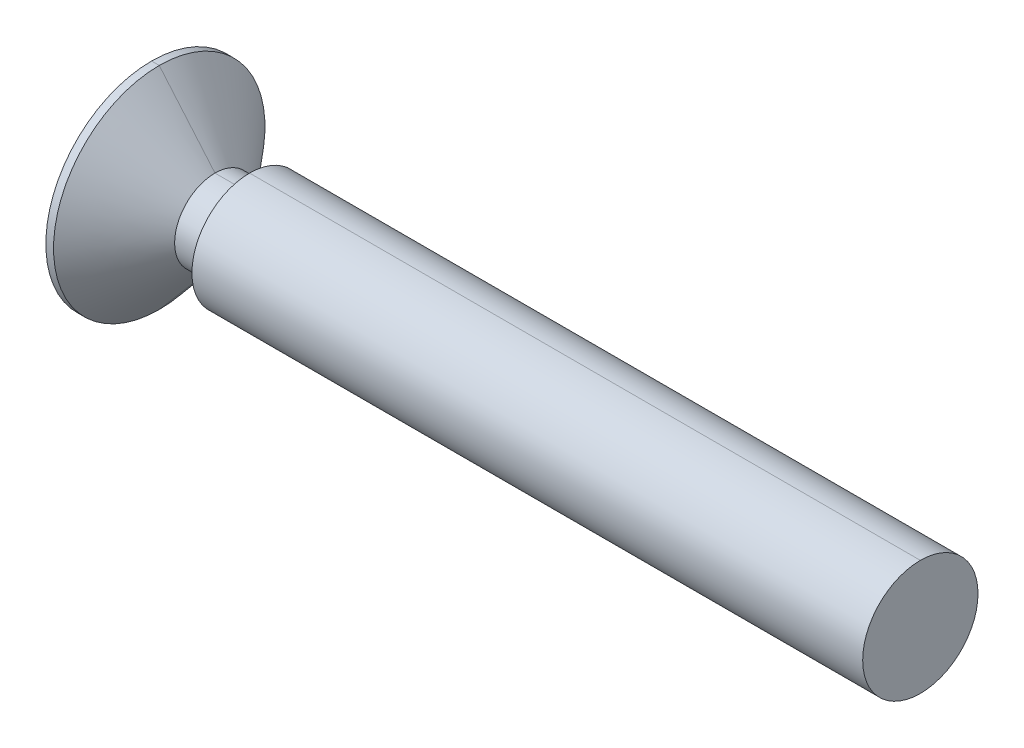
ISO-10303-21;
HEADER;
FILE_DESCRIPTION(('STEP AP214'),'2;1');
FILE_NAME('part.step','',(''),(''),'','','');
FILE_SCHEMA(('AUTOMOTIVE_DESIGN { 1 0 10303 214 1 1 1 1 }'));
ENDSEC;
DATA;
#1=APPLICATION_CONTEXT('core data for automotive mechanical design processes');
#2=APPLICATION_PROTOCOL_DEFINITION('international standard','automotive_design',2000,#1);
#3=PRODUCT_CONTEXT('',#1,'mechanical');
#4=PRODUCT('Part','Part','',(#3));
#5=PRODUCT_RELATED_PRODUCT_CATEGORY('part','',(#4));
#6=PRODUCT_DEFINITION_FORMATION('','',#4);
#7=PRODUCT_DEFINITION_CONTEXT('part definition',#1,'design');
#8=PRODUCT_DEFINITION('design','',#6,#7);
#9=PRODUCT_DEFINITION_SHAPE('','',#8);
#10=(LENGTH_UNIT() NAMED_UNIT(*) SI_UNIT(.MILLI.,.METRE.));
#11=(NAMED_UNIT(*) PLANE_ANGLE_UNIT() SI_UNIT($,.RADIAN.));
#12=(NAMED_UNIT(*) SI_UNIT($,.STERADIAN.) SOLID_ANGLE_UNIT());
#13=UNCERTAINTY_MEASURE_WITH_UNIT(LENGTH_MEASURE(1.E-05),#10,'distance_accuracy_value','');
#14=(GEOMETRIC_REPRESENTATION_CONTEXT(3) GLOBAL_UNCERTAINTY_ASSIGNED_CONTEXT((#13)) GLOBAL_UNIT_ASSIGNED_CONTEXT((#10,
#11,#12)) REPRESENTATION_CONTEXT('',''));
#15=CARTESIAN_POINT('',(0.,0.,0.));
#16=DIRECTION('',(0.,0.,1.));
#17=DIRECTION('',(1.,0.,0.));
#18=AXIS2_PLACEMENT_3D('',#15,#16,#17);
#19=CARTESIAN_POINT('',(-19.175,0.675,-0.675));
#20=DIRECTION('',(1.,0.,0.));
#21=DIRECTION('',(0.,1.,0.));
#22=AXIS2_PLACEMENT_3D('',#19,#20,#21);
#23=PLANE('',#22);
#24=DIRECTION('',(0.,-1.,0.));
#25=VECTOR('',#24,1.);
#26=CARTESIAN_POINT('',(-19.175,1.8,-0.375));
#27=LINE('',#26,#25);
#28=CARTESIAN_POINT('',(-19.175,1.8,-0.375));
#29=VERTEX_POINT('',#28);
#30=CARTESIAN_POINT('',(-19.175,0.675,-0.375));
#31=VERTEX_POINT('',#30);
#32=EDGE_CURVE('E369',#29,#31,#27,.T.);
#33=ORIENTED_EDGE('',*,*,#32,.T.);
#34=CARTESIAN_POINT('',(-19.175,0.675,-0.675));
#35=DIRECTION('',(1.,0.,0.));
#36=DIRECTION('',(0.,1.,0.));
#37=AXIS2_PLACEMENT_3D('',#34,#35,#36);
#38=CIRCLE('',#37,0.3);
#39=CARTESIAN_POINT('',(-19.175,0.375,-0.675));
#40=VERTEX_POINT('',#39);
#41=EDGE_CURVE('E10',#31,#40,#38,.T.);
#42=ORIENTED_EDGE('',*,*,#41,.T.);
#43=DIRECTION('',(0.,0.,-1.));
#44=VECTOR('',#43,1.);
#45=CARTESIAN_POINT('',(-19.175,0.375,-1.8));
#46=LINE('',#45,#44);
#47=CARTESIAN_POINT('',(-19.175,0.375,-1.8));
#48=VERTEX_POINT('',#47);
#49=EDGE_CURVE('E365',#40,#48,#46,.T.);
#50=ORIENTED_EDGE('',*,*,#49,.T.);
#51=DIRECTION('',(0.,-1.,0.));
#52=VECTOR('',#51,1.);
#53=CARTESIAN_POINT('',(-19.175,0.375,-1.8));
#54=LINE('',#53,#52);
#55=CARTESIAN_POINT('',(-19.175,-0.375,-1.8));
#56=VERTEX_POINT('',#55);
#57=EDGE_CURVE('E425',#48,#56,#54,.T.);
#58=ORIENTED_EDGE('',*,*,#57,.T.);
#59=DIRECTION('',(0.,0.,1.));
#60=VECTOR('',#59,1.);
#61=CARTESIAN_POINT('',(-19.175,-0.375,-1.8));
#62=LINE('',#61,#60);
#63=CARTESIAN_POINT('',(-19.175,-0.375,-0.675));
#64=VERTEX_POINT('',#63);
#65=EDGE_CURVE('E335',#56,#64,#62,.T.);
#66=ORIENTED_EDGE('',*,*,#65,.T.);
#67=CARTESIAN_POINT('',(-19.175,-0.675,-0.675));
#68=DIRECTION('',(1.,0.,0.));
#69=DIRECTION('',(0.,-1.,0.));
#70=AXIS2_PLACEMENT_3D('',#67,#68,#69);
#71=CIRCLE('',#70,0.3);
#72=CARTESIAN_POINT('',(-19.175,-0.675,-0.375));
#73=VERTEX_POINT('',#72);
#74=EDGE_CURVE('E336',#64,#73,#71,.T.);
#75=ORIENTED_EDGE('',*,*,#74,.T.);
#76=DIRECTION('',(0.,-1.,0.));
#77=VECTOR('',#76,1.);
#78=CARTESIAN_POINT('',(-19.175,-0.675,-0.375));
#79=LINE('',#78,#77);
#80=CARTESIAN_POINT('',(-19.175,-1.8,-0.375));
#81=VERTEX_POINT('',#80);
#82=EDGE_CURVE('E286',#73,#81,#79,.T.);
#83=ORIENTED_EDGE('',*,*,#82,.T.);
#84=DIRECTION('',(0.,0.,1.));
#85=VECTOR('',#84,1.);
#86=CARTESIAN_POINT('',(-19.175,-1.8,-0.375));
#87=LINE('',#86,#85);
#88=CARTESIAN_POINT('',(-19.175,-1.8,0.375));
#89=VERTEX_POINT('',#88);
#90=EDGE_CURVE('E299',#81,#89,#87,.T.);
#91=ORIENTED_EDGE('',*,*,#90,.T.);
#92=DIRECTION('',(0.,1.,0.));
#93=VECTOR('',#92,1.);
#94=CARTESIAN_POINT('',(-19.175,-0.675,0.375));
#95=LINE('',#94,#93);
#96=CARTESIAN_POINT('',(-19.175,-0.675,0.375));
#97=VERTEX_POINT('',#96);
#98=EDGE_CURVE('E156',#89,#97,#95,.T.);
#99=ORIENTED_EDGE('',*,*,#98,.T.);
#100=CARTESIAN_POINT('',(-19.175,-0.675,0.675));
#101=DIRECTION('',(1.,0.,0.));
#102=DIRECTION('',(0.,1.,0.));
#103=AXIS2_PLACEMENT_3D('',#100,#101,#102);
#104=CIRCLE('',#103,0.3);
#105=CARTESIAN_POINT('',(-19.175,-0.375,0.675));
#106=VERTEX_POINT('',#105);
#107=EDGE_CURVE('E166',#97,#106,#104,.T.);
#108=ORIENTED_EDGE('',*,*,#107,.T.);
#109=DIRECTION('',(0.,0.,1.));
#110=VECTOR('',#109,1.);
#111=CARTESIAN_POINT('',(-19.175,-0.375,0.675));
#112=LINE('',#111,#110);
#113=CARTESIAN_POINT('',(-19.175,-0.375,1.8));
#114=VERTEX_POINT('',#113);
#115=EDGE_CURVE('E293',#106,#114,#112,.T.);
#116=ORIENTED_EDGE('',*,*,#115,.T.);
#117=DIRECTION('',(0.,1.,0.));
#118=VECTOR('',#117,1.);
#119=CARTESIAN_POINT('',(-19.175,0.375,1.8));
#120=LINE('',#119,#118);
#121=CARTESIAN_POINT('',(-19.175,0.375,1.8));
#122=VERTEX_POINT('',#121);
#123=EDGE_CURVE('E338',#114,#122,#120,.T.);
#124=ORIENTED_EDGE('',*,*,#123,.T.);
#125=DIRECTION('',(0.,0.,-1.));
#126=VECTOR('',#125,1.);
#127=CARTESIAN_POINT('',(-19.175,0.375,0.675));
#128=LINE('',#127,#126);
#129=CARTESIAN_POINT('',(-19.175,0.375,0.675));
#130=VERTEX_POINT('',#129);
#131=EDGE_CURVE('E349',#122,#130,#128,.T.);
#132=ORIENTED_EDGE('',*,*,#131,.T.);
#133=CARTESIAN_POINT('',(-19.175,0.675,0.675));
#134=DIRECTION('',(1.,0.,0.));
#135=DIRECTION('',(0.,1.,0.));
#136=AXIS2_PLACEMENT_3D('',#133,#134,#135);
#137=CIRCLE('',#136,0.3);
#138=CARTESIAN_POINT('',(-19.175,0.675,0.375));
#139=VERTEX_POINT('',#138);
#140=EDGE_CURVE('E383',#130,#139,#137,.T.);
#141=ORIENTED_EDGE('',*,*,#140,.T.);
#142=DIRECTION('',(0.,1.,0.));
#143=VECTOR('',#142,1.);
#144=CARTESIAN_POINT('',(-19.175,1.8,0.375));
#145=LINE('',#144,#143);
#146=CARTESIAN_POINT('',(-19.175,1.8,0.375));
#147=VERTEX_POINT('',#146);
#148=EDGE_CURVE('E271',#139,#147,#145,.T.);
#149=ORIENTED_EDGE('',*,*,#148,.T.);
#150=DIRECTION('',(0.,0.,-1.));
#151=VECTOR('',#150,1.);
#152=CARTESIAN_POINT('',(-19.175,1.8,-0.375));
#153=LINE('',#152,#151);
#154=EDGE_CURVE('E278',#147,#29,#153,.T.);
#155=ORIENTED_EDGE('',*,*,#154,.T.);
#156=EDGE_LOOP('',(#33,#42,#50,#58,#66,#75,#83,#91,#99,#108,#116,#124,#132,#141,#149,#155));
#157=FACE_BOUND('',#156,.T.);
#158=ADVANCED_FACE('F16',(#157),#23,.F.);
#159=CARTESIAN_POINT('',(-19.175,0.675,-0.675));
#160=DIRECTION('',(-1.,0.,0.));
#161=DIRECTION('',(0.,-1.,0.));
#162=AXIS2_PLACEMENT_3D('',#159,#160,#161);
#163=CYLINDRICAL_SURFACE('',#162,0.3);
#164=CARTESIAN_POINT('',(-20.,0.675,-0.675));
#165=DIRECTION('',(1.,0.,0.));
#166=DIRECTION('',(0.,1.,0.));
#167=AXIS2_PLACEMENT_3D('',#164,#165,#166);
#168=CIRCLE('',#167,0.3);
#169=CARTESIAN_POINT('',(-20.,0.675,-0.375));
#170=VERTEX_POINT('',#169);
#171=CARTESIAN_POINT('',(-20.,0.375,-0.675));
#172=VERTEX_POINT('',#171);
#173=EDGE_CURVE('E322',#170,#172,#168,.T.);
#174=ORIENTED_EDGE('',*,*,#173,.T.);
#175=DIRECTION('',(-1.,0.,0.));
#176=VECTOR('',#175,1.);
#177=CARTESIAN_POINT('',(-19.175,0.375,-0.675));
#178=LINE('',#177,#176);
#179=EDGE_CURVE('E27',#40,#172,#178,.T.);
#180=ORIENTED_EDGE('',*,*,#179,.F.);
#181=ORIENTED_EDGE('',*,*,#41,.F.);
#182=DIRECTION('',(-1.,0.,0.));
#183=VECTOR('',#182,1.);
#184=CARTESIAN_POINT('',(-19.175,0.675,-0.375));
#185=LINE('',#184,#183);
#186=EDGE_CURVE('E267',#31,#170,#185,.T.);
#187=ORIENTED_EDGE('',*,*,#186,.T.);
#188=EDGE_LOOP('',(#174,#180,#181,#187));
#189=FACE_BOUND('',#188,.T.);
#190=ADVANCED_FACE('F727',(#189),#163,.T.);
#191=CARTESIAN_POINT('',(-19.175,0.375,-1.8));
#192=DIRECTION('',(0.,1.,0.));
#193=DIRECTION('',(1.,0.,0.));
#194=AXIS2_PLACEMENT_3D('',#191,#192,#193);
#195=PLANE('',#194);
#196=DIRECTION('',(0.,0.,-1.));
#197=VECTOR('',#196,1.);
#198=CARTESIAN_POINT('',(-20.,0.375,-1.8));
#199=LINE('',#198,#197);
#200=CARTESIAN_POINT('',(-20.,0.375,-1.8));
#201=VERTEX_POINT('',#200);
#202=EDGE_CURVE('E318',#172,#201,#199,.T.);
#203=ORIENTED_EDGE('',*,*,#202,.T.);
#204=DIRECTION('',(-1.,0.,0.));
#205=VECTOR('',#204,1.);
#206=CARTESIAN_POINT('',(-19.175,0.375,-1.8));
#207=LINE('',#206,#205);
#208=EDGE_CURVE('E368',#48,#201,#207,.T.);
#209=ORIENTED_EDGE('',*,*,#208,.F.);
#210=ORIENTED_EDGE('',*,*,#49,.F.);
#211=ORIENTED_EDGE('',*,*,#179,.T.);
#212=EDGE_LOOP('',(#203,#209,#210,#211));
#213=FACE_BOUND('',#212,.T.);
#214=ADVANCED_FACE('F723',(#213),#195,.F.);
#215=CARTESIAN_POINT('',(-19.175,0.375,-1.8));
#216=DIRECTION('',(0.,0.,-1.));
#217=DIRECTION('',(0.,-1.,0.));
#218=AXIS2_PLACEMENT_3D('',#215,#216,#217);
#219=PLANE('',#218);
#220=DIRECTION('',(0.,-1.,0.));
#221=VECTOR('',#220,1.);
#222=CARTESIAN_POINT('',(-20.,0.375,-1.8));
#223=LINE('',#222,#221);
#224=CARTESIAN_POINT('',(-20.,-0.375,-1.8));
#225=VERTEX_POINT('',#224);
#226=EDGE_CURVE('E323',#201,#225,#223,.T.);
#227=ORIENTED_EDGE('',*,*,#226,.T.);
#228=DIRECTION('',(-1.,0.,0.));
#229=VECTOR('',#228,1.);
#230=CARTESIAN_POINT('',(-19.175,-0.375,-1.8));
#231=LINE('',#230,#229);
#232=EDGE_CURVE('E422',#56,#225,#231,.T.);
#233=ORIENTED_EDGE('',*,*,#232,.F.);
#234=ORIENTED_EDGE('',*,*,#57,.F.);
#235=ORIENTED_EDGE('',*,*,#208,.T.);
#236=EDGE_LOOP('',(#227,#233,#234,#235));
#237=FACE_BOUND('',#236,.T.);
#238=ADVANCED_FACE('F485',(#237),#219,.F.);
#239=CARTESIAN_POINT('',(-19.175,-0.375,-1.8));
#240=DIRECTION('',(0.,-1.,0.));
#241=DIRECTION('',(0.,0.,-1.));
#242=AXIS2_PLACEMENT_3D('',#239,#240,#241);
#243=PLANE('',#242);
#244=DIRECTION('',(0.,0.,1.));
#245=VECTOR('',#244,1.);
#246=CARTESIAN_POINT('',(-20.,-0.375,-1.8));
#247=LINE('',#246,#245);
#248=CARTESIAN_POINT('',(-20.,-0.375,-0.675));
#249=VERTEX_POINT('',#248);
#250=EDGE_CURVE('E308',#225,#249,#247,.T.);
#251=ORIENTED_EDGE('',*,*,#250,.T.);
#252=DIRECTION('',(-1.,0.,0.));
#253=VECTOR('',#252,1.);
#254=CARTESIAN_POINT('',(-19.175,-0.375,-0.675));
#255=LINE('',#254,#253);
#256=EDGE_CURVE('E333',#64,#249,#255,.T.);
#257=ORIENTED_EDGE('',*,*,#256,.F.);
#258=ORIENTED_EDGE('',*,*,#65,.F.);
#259=ORIENTED_EDGE('',*,*,#232,.T.);
#260=EDGE_LOOP('',(#251,#257,#258,#259));
#261=FACE_BOUND('',#260,.T.);
#262=ADVANCED_FACE('F489',(#261),#243,.F.);
#263=CARTESIAN_POINT('',(-19.175,-0.675,-0.675));
#264=DIRECTION('',(-1.,0.,0.));
#265=DIRECTION('',(0.,-1.,0.));
#266=AXIS2_PLACEMENT_3D('',#263,#264,#265);
#267=CYLINDRICAL_SURFACE('',#266,0.3);
#268=CARTESIAN_POINT('',(-20.,-0.675,-0.675));
#269=DIRECTION('',(1.,0.,0.));
#270=DIRECTION('',(0.,-1.,0.));
#271=AXIS2_PLACEMENT_3D('',#268,#269,#270);
#272=CIRCLE('',#271,0.3);
#273=CARTESIAN_POINT('',(-20.,-0.675,-0.375));
#274=VERTEX_POINT('',#273);
#275=EDGE_CURVE('E304',#249,#274,#272,.T.);
#276=ORIENTED_EDGE('',*,*,#275,.T.);
#277=DIRECTION('',(-1.,0.,0.));
#278=VECTOR('',#277,1.);
#279=CARTESIAN_POINT('',(-19.175,-0.675,-0.375));
#280=LINE('',#279,#278);
#281=EDGE_CURVE('E289',#73,#274,#280,.T.);
#282=ORIENTED_EDGE('',*,*,#281,.F.);
#283=ORIENTED_EDGE('',*,*,#74,.F.);
#284=ORIENTED_EDGE('',*,*,#256,.T.);
#285=EDGE_LOOP('',(#276,#282,#283,#284));
#286=FACE_BOUND('',#285,.T.);
#287=ADVANCED_FACE('F494',(#286),#267,.T.);
#288=CARTESIAN_POINT('',(-19.175,-0.675,-0.375));
#289=DIRECTION('',(0.,0.,-1.));
#290=DIRECTION('',(0.,-1.,0.));
#291=AXIS2_PLACEMENT_3D('',#288,#289,#290);
#292=PLANE('',#291);
#293=DIRECTION('',(0.,-1.,0.));
#294=VECTOR('',#293,1.);
#295=CARTESIAN_POINT('',(-20.,-0.675,-0.375));
#296=LINE('',#295,#294);
#297=CARTESIAN_POINT('',(-20.,-1.8,-0.375));
#298=VERTEX_POINT('',#297);
#299=EDGE_CURVE('E309',#274,#298,#296,.T.);
#300=ORIENTED_EDGE('',*,*,#299,.T.);
#301=DIRECTION('',(-1.,0.,0.));
#302=VECTOR('',#301,1.);
#303=CARTESIAN_POINT('',(-19.175,-1.8,-0.375));
#304=LINE('',#303,#302);
#305=EDGE_CURVE('E290',#81,#298,#304,.T.);
#306=ORIENTED_EDGE('',*,*,#305,.F.);
#307=ORIENTED_EDGE('',*,*,#82,.F.);
#308=ORIENTED_EDGE('',*,*,#281,.T.);
#309=EDGE_LOOP('',(#300,#306,#307,#308));
#310=FACE_BOUND('',#309,.T.);
#311=ADVANCED_FACE('F500',(#310),#292,.F.);
#312=CARTESIAN_POINT('',(-19.175,-1.8,-0.375));
#313=DIRECTION('',(0.,-1.,0.));
#314=DIRECTION('',(0.,0.,-1.));
#315=AXIS2_PLACEMENT_3D('',#312,#313,#314);
#316=PLANE('',#315);
#317=DIRECTION('',(0.,0.,1.));
#318=VECTOR('',#317,1.);
#319=CARTESIAN_POINT('',(-20.,-1.8,-0.375));
#320=LINE('',#319,#318);
#321=CARTESIAN_POINT('',(-20.,-1.8,0.375));
#322=VERTEX_POINT('',#321);
#323=EDGE_CURVE('E402',#298,#322,#320,.T.);
#324=ORIENTED_EDGE('',*,*,#323,.T.);
#325=DIRECTION('',(-1.,0.,0.));
#326=VECTOR('',#325,1.);
#327=CARTESIAN_POINT('',(-19.175,-1.8,0.375));
#328=LINE('',#327,#326);
#329=EDGE_CURVE('E317',#89,#322,#328,.T.);
#330=ORIENTED_EDGE('',*,*,#329,.F.);
#331=ORIENTED_EDGE('',*,*,#90,.F.);
#332=ORIENTED_EDGE('',*,*,#305,.T.);
#333=EDGE_LOOP('',(#324,#330,#331,#332));
#334=FACE_BOUND('',#333,.T.);
#335=ADVANCED_FACE('F504',(#334),#316,.F.);
#336=CARTESIAN_POINT('',(-19.175,-0.675,0.375));
#337=DIRECTION('',(0.,0.,1.));
#338=DIRECTION('',(0.,-1.,0.));
#339=AXIS2_PLACEMENT_3D('',#336,#337,#338);
#340=PLANE('',#339);
#341=DIRECTION('',(0.,1.,0.));
#342=VECTOR('',#341,1.);
#343=CARTESIAN_POINT('',(-20.,-0.675,0.375));
#344=LINE('',#343,#342);
#345=CARTESIAN_POINT('',(-20.,-0.675,0.375));
#346=VERTEX_POINT('',#345);
#347=EDGE_CURVE('E332',#322,#346,#344,.T.);
#348=ORIENTED_EDGE('',*,*,#347,.T.);
#349=DIRECTION('',(-1.,0.,0.));
#350=VECTOR('',#349,1.);
#351=CARTESIAN_POINT('',(-19.175,-0.675,0.375));
#352=LINE('',#351,#350);
#353=EDGE_CURVE('E192',#97,#346,#352,.T.);
#354=ORIENTED_EDGE('',*,*,#353,.F.);
#355=ORIENTED_EDGE('',*,*,#98,.F.);
#356=ORIENTED_EDGE('',*,*,#329,.T.);
#357=EDGE_LOOP('',(#348,#354,#355,#356));
#358=FACE_BOUND('',#357,.T.);
#359=ADVANCED_FACE('F507',(#358),#340,.F.);
#360=CARTESIAN_POINT('',(-19.175,-0.675,0.675));
#361=DIRECTION('',(-1.,0.,0.));
#362=DIRECTION('',(0.,-1.,0.));
#363=AXIS2_PLACEMENT_3D('',#360,#361,#362);
#364=CYLINDRICAL_SURFACE('',#363,0.3);
#365=CARTESIAN_POINT('',(-20.,-0.675,0.675));
#366=DIRECTION('',(1.,0.,0.));
#367=DIRECTION('',(0.,1.,0.));
#368=AXIS2_PLACEMENT_3D('',#365,#366,#367);
#369=CIRCLE('',#368,0.3);
#370=CARTESIAN_POINT('',(-20.,-0.375,0.675));
#371=VERTEX_POINT('',#370);
#372=EDGE_CURVE('E313',#346,#371,#369,.T.);
#373=ORIENTED_EDGE('',*,*,#372,.T.);
#374=DIRECTION('',(-1.,0.,0.));
#375=VECTOR('',#374,1.);
#376=CARTESIAN_POINT('',(-19.175,-0.375,0.675));
#377=LINE('',#376,#375);
#378=EDGE_CURVE('E184',#106,#371,#377,.T.);
#379=ORIENTED_EDGE('',*,*,#378,.F.);
#380=ORIENTED_EDGE('',*,*,#107,.F.);
#381=ORIENTED_EDGE('',*,*,#353,.T.);
#382=EDGE_LOOP('',(#373,#379,#380,#381));
#383=FACE_BOUND('',#382,.T.);
#384=ADVANCED_FACE('F509',(#383),#364,.T.);
#385=CARTESIAN_POINT('',(-19.175,-0.375,0.675));
#386=DIRECTION('',(0.,-1.,0.));
#387=DIRECTION('',(0.,0.,-1.));
#388=AXIS2_PLACEMENT_3D('',#385,#386,#387);
#389=PLANE('',#388);
#390=DIRECTION('',(0.,0.,1.));
#391=VECTOR('',#390,1.);
#392=CARTESIAN_POINT('',(-20.,-0.375,0.675));
#393=LINE('',#392,#391);
#394=CARTESIAN_POINT('',(-20.,-0.375,1.8));
#395=VERTEX_POINT('',#394);
#396=EDGE_CURVE('E310',#371,#395,#393,.T.);
#397=ORIENTED_EDGE('',*,*,#396,.T.);
#398=DIRECTION('',(-1.,0.,0.));
#399=VECTOR('',#398,1.);
#400=CARTESIAN_POINT('',(-19.175,-0.375,1.8));
#401=LINE('',#400,#399);
#402=EDGE_CURVE('E341',#114,#395,#401,.T.);
#403=ORIENTED_EDGE('',*,*,#402,.F.);
#404=ORIENTED_EDGE('',*,*,#115,.F.);
#405=ORIENTED_EDGE('',*,*,#378,.T.);
#406=EDGE_LOOP('',(#397,#403,#404,#405));
#407=FACE_BOUND('',#406,.T.);
#408=ADVANCED_FACE('F512',(#407),#389,.F.);
#409=CARTESIAN_POINT('',(-19.175,0.375,1.8));
#410=DIRECTION('',(0.,0.,1.));
#411=DIRECTION('',(1.,0.,0.));
#412=AXIS2_PLACEMENT_3D('',#409,#410,#411);
#413=PLANE('',#412);
#414=DIRECTION('',(0.,1.,0.));
#415=VECTOR('',#414,1.);
#416=CARTESIAN_POINT('',(-20.,0.375,1.8));
#417=LINE('',#416,#415);
#418=CARTESIAN_POINT('',(-20.,0.375,1.8));
#419=VERTEX_POINT('',#418);
#420=EDGE_CURVE('E314',#395,#419,#417,.T.);
#421=ORIENTED_EDGE('',*,*,#420,.T.);
#422=DIRECTION('',(-1.,0.,0.));
#423=VECTOR('',#422,1.);
#424=CARTESIAN_POINT('',(-19.175,0.375,1.8));
#425=LINE('',#424,#423);
#426=EDGE_CURVE('E342',#122,#419,#425,.T.);
#427=ORIENTED_EDGE('',*,*,#426,.F.);
#428=ORIENTED_EDGE('',*,*,#123,.F.);
#429=ORIENTED_EDGE('',*,*,#402,.T.);
#430=EDGE_LOOP('',(#421,#427,#428,#429));
#431=FACE_BOUND('',#430,.T.);
#432=ADVANCED_FACE('F518',(#431),#413,.F.);
#433=CARTESIAN_POINT('',(-19.175,0.375,0.675));
#434=DIRECTION('',(0.,1.,0.));
#435=DIRECTION('',(0.,0.,-1.));
#436=AXIS2_PLACEMENT_3D('',#433,#434,#435);
#437=PLANE('',#436);
#438=DIRECTION('',(0.,0.,-1.));
#439=VECTOR('',#438,1.);
#440=CARTESIAN_POINT('',(-20.,0.375,0.675));
#441=LINE('',#440,#439);
#442=CARTESIAN_POINT('',(-20.,0.375,0.675));
#443=VERTEX_POINT('',#442);
#444=EDGE_CURVE('E390',#419,#443,#441,.T.);
#445=ORIENTED_EDGE('',*,*,#444,.T.);
#446=DIRECTION('',(-1.,0.,0.));
#447=VECTOR('',#446,1.);
#448=CARTESIAN_POINT('',(-19.175,0.375,0.675));
#449=LINE('',#448,#447);
#450=EDGE_CURVE('E353',#130,#443,#449,.T.);
#451=ORIENTED_EDGE('',*,*,#450,.F.);
#452=ORIENTED_EDGE('',*,*,#131,.F.);
#453=ORIENTED_EDGE('',*,*,#426,.T.);
#454=EDGE_LOOP('',(#445,#451,#452,#453));
#455=FACE_BOUND('',#454,.T.);
#456=ADVANCED_FACE('F522',(#455),#437,.F.);
#457=CARTESIAN_POINT('',(-19.175,0.675,0.675));
#458=DIRECTION('',(-1.,0.,0.));
#459=DIRECTION('',(0.,-1.,0.));
#460=AXIS2_PLACEMENT_3D('',#457,#458,#459);
#461=CYLINDRICAL_SURFACE('',#460,0.3);
#462=CARTESIAN_POINT('',(-20.,0.675,0.675));
#463=DIRECTION('',(1.,0.,0.));
#464=DIRECTION('',(0.,1.,0.));
#465=AXIS2_PLACEMENT_3D('',#462,#463,#464);
#466=CIRCLE('',#465,0.3);
#467=CARTESIAN_POINT('',(-20.,0.675,0.375));
#468=VERTEX_POINT('',#467);
#469=EDGE_CURVE('E386',#443,#468,#466,.T.);
#470=ORIENTED_EDGE('',*,*,#469,.T.);
#471=DIRECTION('',(-1.,0.,0.));
#472=VECTOR('',#471,1.);
#473=CARTESIAN_POINT('',(-19.175,0.675,0.375));
#474=LINE('',#473,#472);
#475=EDGE_CURVE('E274',#139,#468,#474,.T.);
#476=ORIENTED_EDGE('',*,*,#475,.F.);
#477=ORIENTED_EDGE('',*,*,#140,.F.);
#478=ORIENTED_EDGE('',*,*,#450,.T.);
#479=EDGE_LOOP('',(#470,#476,#477,#478));
#480=FACE_BOUND('',#479,.T.);
#481=ADVANCED_FACE('F527',(#480),#461,.T.);
#482=CARTESIAN_POINT('',(-19.175,1.8,0.375));
#483=DIRECTION('',(0.,0.,1.));
#484=DIRECTION('',(0.,-1.,0.));
#485=AXIS2_PLACEMENT_3D('',#482,#483,#484);
#486=PLANE('',#485);
#487=DIRECTION('',(0.,1.,0.));
#488=VECTOR('',#487,1.);
#489=CARTESIAN_POINT('',(-20.,1.8,0.375));
#490=LINE('',#489,#488);
#491=CARTESIAN_POINT('',(-20.,1.8,0.375));
#492=VERTEX_POINT('',#491);
#493=EDGE_CURVE('E391',#468,#492,#490,.T.);
#494=ORIENTED_EDGE('',*,*,#493,.T.);
#495=DIRECTION('',(-1.,0.,0.));
#496=VECTOR('',#495,1.);
#497=CARTESIAN_POINT('',(-19.175,1.8,0.375));
#498=LINE('',#497,#496);
#499=EDGE_CURVE('E275',#147,#492,#498,.T.);
#500=ORIENTED_EDGE('',*,*,#499,.F.);
#501=ORIENTED_EDGE('',*,*,#148,.F.);
#502=ORIENTED_EDGE('',*,*,#475,.T.);
#503=EDGE_LOOP('',(#494,#500,#501,#502));
#504=FACE_BOUND('',#503,.T.);
#505=ADVANCED_FACE('F533',(#504),#486,.F.);
#506=CARTESIAN_POINT('',(-19.175,1.8,-0.375));
#507=DIRECTION('',(0.,1.,0.));
#508=DIRECTION('',(0.,0.,-1.));
#509=AXIS2_PLACEMENT_3D('',#506,#507,#508);
#510=PLANE('',#509);
#511=DIRECTION('',(0.,0.,-1.));
#512=VECTOR('',#511,1.);
#513=CARTESIAN_POINT('',(-20.,1.8,-0.375));
#514=LINE('',#513,#512);
#515=CARTESIAN_POINT('',(-20.,1.8,-0.375));
#516=VERTEX_POINT('',#515);
#517=EDGE_CURVE('E380',#492,#516,#514,.T.);
#518=ORIENTED_EDGE('',*,*,#517,.T.);
#519=DIRECTION('',(-1.,0.,0.));
#520=VECTOR('',#519,1.);
#521=CARTESIAN_POINT('',(-19.175,1.8,-0.375));
#522=LINE('',#521,#520);
#523=EDGE_CURVE('E281',#29,#516,#522,.T.);
#524=ORIENTED_EDGE('',*,*,#523,.F.);
#525=ORIENTED_EDGE('',*,*,#154,.F.);
#526=ORIENTED_EDGE('',*,*,#499,.T.);
#527=EDGE_LOOP('',(#518,#524,#525,#526));
#528=FACE_BOUND('',#527,.T.);
#529=ADVANCED_FACE('F537',(#528),#510,.F.);
#530=CARTESIAN_POINT('',(-19.175,1.8,-0.375));
#531=DIRECTION('',(0.,0.,-1.));
#532=DIRECTION('',(0.,-1.,0.));
#533=AXIS2_PLACEMENT_3D('',#530,#531,#532);
#534=PLANE('',#533);
#535=DIRECTION('',(0.,-1.,0.));
#536=VECTOR('',#535,1.);
#537=CARTESIAN_POINT('',(-20.,1.8,-0.375));
#538=LINE('',#537,#536);
#539=EDGE_CURVE('E376',#516,#170,#538,.T.);
#540=ORIENTED_EDGE('',*,*,#539,.T.);
#541=ORIENTED_EDGE('',*,*,#186,.F.);
#542=ORIENTED_EDGE('',*,*,#32,.F.);
#543=ORIENTED_EDGE('',*,*,#523,.T.);
#544=EDGE_LOOP('',(#540,#541,#542,#543));
#545=FACE_BOUND('',#544,.T.);
#546=ADVANCED_FACE('F18',(#545),#534,.F.);
#547=CARTESIAN_POINT('',(-20.,2.75,0.));
#548=DIRECTION('',(-1.,0.,0.));
#549=DIRECTION('',(0.,1.,0.));
#550=AXIS2_PLACEMENT_3D('',#547,#548,#549);
#551=PLANE('',#550);
#552=ORIENTED_EDGE('',*,*,#539,.F.);
#553=ORIENTED_EDGE('',*,*,#517,.F.);
#554=ORIENTED_EDGE('',*,*,#493,.F.);
#555=ORIENTED_EDGE('',*,*,#469,.F.);
#556=ORIENTED_EDGE('',*,*,#444,.F.);
#557=ORIENTED_EDGE('',*,*,#420,.F.);
#558=ORIENTED_EDGE('',*,*,#396,.F.);
#559=ORIENTED_EDGE('',*,*,#372,.F.);
#560=ORIENTED_EDGE('',*,*,#347,.F.);
#561=ORIENTED_EDGE('',*,*,#323,.F.);
#562=ORIENTED_EDGE('',*,*,#299,.F.);
#563=ORIENTED_EDGE('',*,*,#275,.F.);
#564=ORIENTED_EDGE('',*,*,#250,.F.);
#565=ORIENTED_EDGE('',*,*,#226,.F.);
#566=ORIENTED_EDGE('',*,*,#202,.F.);
#567=ORIENTED_EDGE('',*,*,#173,.F.);
#568=EDGE_LOOP('',(#552,#553,#554,#555,#556,#557,#558,#559,#560,#561,#562,#563,#564,#565,#566,#567));
#569=FACE_BOUND('',#568,.T.);
#570=CARTESIAN_POINT('',(-20.,0.,0.));
#571=DIRECTION('',(1.,0.,0.));
#572=DIRECTION('',(0.,1.,0.));
#573=AXIS2_PLACEMENT_3D('',#570,#571,#572);
#574=CIRCLE('',#573,2.75);
#575=CARTESIAN_POINT('',(-20.,2.75,0.));
#576=VERTEX_POINT('',#575);
#577=CARTESIAN_POINT('',(-20.,-2.75,0.));
#578=VERTEX_POINT('',#577);
#579=EDGE_CURVE('E364',#576,#578,#574,.T.);
#580=ORIENTED_EDGE('',*,*,#579,.F.);
#581=CARTESIAN_POINT('',(-20.,0.,0.));
#582=DIRECTION('',(1.,0.,0.));
#583=DIRECTION('',(0.,1.,0.));
#584=AXIS2_PLACEMENT_3D('',#581,#582,#583);
#585=CIRCLE('',#584,2.75);
#586=EDGE_CURVE('E303',#578,#576,#585,.T.);
#587=ORIENTED_EDGE('',*,*,#586,.F.);
#588=EDGE_LOOP('',(#580,#587));
#589=FACE_BOUND('',#588,.T.);
#590=ADVANCED_FACE('F459',(#569,#589),#551,.T.);
#591=CARTESIAN_POINT('',(0.,0.,0.));
#592=DIRECTION('',(1.,0.,0.));
#593=DIRECTION('',(0.,1.,0.));
#594=AXIS2_PLACEMENT_3D('',#591,#592,#593);
#595=CYLINDRICAL_SURFACE('',#594,2.75);
#596=DIRECTION('',(1.,0.,0.));
#597=VECTOR('',#596,1.);
#598=CARTESIAN_POINT('',(0.,-2.75,0.));
#599=LINE('',#598,#597);
#600=CARTESIAN_POINT('',(-19.8,-2.75,0.));
#601=VERTEX_POINT('',#600);
#602=EDGE_CURVE('E329',#578,#601,#599,.T.);
#603=ORIENTED_EDGE('',*,*,#602,.F.);
#604=ORIENTED_EDGE('',*,*,#586,.T.);
#605=DIRECTION('',(1.,0.,0.));
#606=VECTOR('',#605,1.);
#607=CARTESIAN_POINT('',(0.,2.75,0.));
#608=LINE('',#607,#606);
#609=CARTESIAN_POINT('',(-19.8,2.75,0.));
#610=VERTEX_POINT('',#609);
#611=EDGE_CURVE('E328',#576,#610,#608,.T.);
#612=ORIENTED_EDGE('',*,*,#611,.T.);
#613=CARTESIAN_POINT('',(-19.8,0.,0.));
#614=DIRECTION('',(1.,0.,0.));
#615=DIRECTION('',(0.,1.,0.));
#616=AXIS2_PLACEMENT_3D('',#613,#614,#615);
#617=CIRCLE('',#616,2.75);
#618=EDGE_CURVE('E300',#601,#610,#617,.T.);
#619=ORIENTED_EDGE('',*,*,#618,.F.);
#620=EDGE_LOOP('',(#603,#604,#612,#619));
#621=FACE_BOUND('',#620,.T.);
#622=ADVANCED_FACE('F452',(#621),#595,.T.);
#623=CARTESIAN_POINT('',(-18.35,0.,0.));
#624=DIRECTION('',(-1.,0.,0.));
#625=DIRECTION('',(0.,-1.,0.));
#626=AXIS2_PLACEMENT_3D('',#623,#624,#625);
#627=CONICAL_SURFACE('',#626,1.05,0.864597234366898);
#628=DIRECTION('',(-0.648946606082751,0.760833951959085,0.));
#629=VECTOR('',#628,1.);
#630=CARTESIAN_POINT('',(-18.35,1.05,0.));
#631=LINE('',#630,#629);
#632=CARTESIAN_POINT('',(-18.35,1.05,0.));
#633=VERTEX_POINT('',#632);
#634=EDGE_CURVE('E357',#633,#610,#631,.T.);
#635=ORIENTED_EDGE('',*,*,#634,.F.);
#636=CARTESIAN_POINT('',(-18.35,0.,0.));
#637=DIRECTION('',(1.,0.,0.));
#638=DIRECTION('',(0.,1.,0.));
#639=AXIS2_PLACEMENT_3D('',#636,#637,#638);
#640=CIRCLE('',#639,1.05);
#641=CARTESIAN_POINT('',(-18.35,-1.05,0.));
#642=VERTEX_POINT('',#641);
#643=EDGE_CURVE('E296',#642,#633,#640,.T.);
#644=ORIENTED_EDGE('',*,*,#643,.F.);
#645=DIRECTION('',(-0.648946606082751,-0.760833951959085,0.));
#646=VECTOR('',#645,1.);
#647=CARTESIAN_POINT('',(-18.35,-1.05,0.));
#648=LINE('',#647,#646);
#649=EDGE_CURVE('E348',#642,#601,#648,.T.);
#650=ORIENTED_EDGE('',*,*,#649,.T.);
#651=ORIENTED_EDGE('',*,*,#618,.T.);
#652=EDGE_LOOP('',(#635,#644,#650,#651));
#653=FACE_BOUND('',#652,.T.);
#654=ADVANCED_FACE('F736',(#653),#627,.T.);
#655=CARTESIAN_POINT('',(0.,0.,0.));
#656=DIRECTION('',(1.,0.,0.));
#657=DIRECTION('',(0.,1.,0.));
#658=AXIS2_PLACEMENT_3D('',#655,#656,#657);
#659=CYLINDRICAL_SURFACE('',#658,1.05);
#660=DIRECTION('',(1.,0.,0.));
#661=VECTOR('',#660,1.);
#662=CARTESIAN_POINT('',(0.,-1.05,0.));
#663=LINE('',#662,#661);
#664=CARTESIAN_POINT('',(-17.45,-1.05,0.));
#665=VERTEX_POINT('',#664);
#666=EDGE_CURVE('E285',#642,#665,#663,.T.);
#667=ORIENTED_EDGE('',*,*,#666,.F.);
#668=ORIENTED_EDGE('',*,*,#643,.T.);
#669=DIRECTION('',(1.,0.,0.));
#670=VECTOR('',#669,1.);
#671=CARTESIAN_POINT('',(0.,1.05,0.));
#672=LINE('',#671,#670);
#673=CARTESIAN_POINT('',(-17.45,1.05,0.));
#674=VERTEX_POINT('',#673);
#675=EDGE_CURVE('E254',#633,#674,#672,.T.);
#676=ORIENTED_EDGE('',*,*,#675,.T.);
#677=CARTESIAN_POINT('',(-17.45,0.,0.));
#678=DIRECTION('',(1.,0.,0.));
#679=DIRECTION('',(0.,1.,0.));
#680=AXIS2_PLACEMENT_3D('',#677,#678,#679);
#681=CIRCLE('',#680,1.05);
#682=EDGE_CURVE('E243',#665,#674,#681,.T.);
#683=ORIENTED_EDGE('',*,*,#682,.F.);
#684=EDGE_LOOP('',(#667,#668,#676,#683));
#685=FACE_BOUND('',#684,.T.);
#686=ADVANCED_FACE('F718',(#685),#659,.T.);
#687=CARTESIAN_POINT('',(-17.45,1.5,0.));
#688=DIRECTION('',(-1.,0.,0.));
#689=DIRECTION('',(0.,1.,0.));
#690=AXIS2_PLACEMENT_3D('',#687,#688,#689);
#691=PLANE('',#690);
#692=CARTESIAN_POINT('',(-17.45,0.,0.));
#693=DIRECTION('',(1.,0.,0.));
#694=DIRECTION('',(0.,1.,0.));
#695=AXIS2_PLACEMENT_3D('',#692,#693,#694);
#696=CIRCLE('',#695,1.05);
#697=EDGE_CURVE('E263',#674,#665,#696,.T.);
#698=ORIENTED_EDGE('',*,*,#697,.T.);
#699=ORIENTED_EDGE('',*,*,#682,.T.);
#700=EDGE_LOOP('',(#698,#699));
#701=FACE_BOUND('',#700,.T.);
#702=CARTESIAN_POINT('',(-17.45,0.,0.));
#703=DIRECTION('',(1.,0.,0.));
#704=DIRECTION('',(0.,1.,0.));
#705=AXIS2_PLACEMENT_3D('',#702,#703,#704);
#706=CIRCLE('',#705,1.5);
#707=CARTESIAN_POINT('',(-17.45,1.5,0.));
#708=VERTEX_POINT('',#707);
#709=CARTESIAN_POINT('',(-17.45,-1.5,0.));
#710=VERTEX_POINT('',#709);
#711=EDGE_CURVE('E248',#708,#710,#706,.T.);
#712=ORIENTED_EDGE('',*,*,#711,.F.);
#713=CARTESIAN_POINT('',(-17.45,0.,0.));
#714=DIRECTION('',(1.,0.,0.));
#715=DIRECTION('',(0.,1.,0.));
#716=AXIS2_PLACEMENT_3D('',#713,#714,#715);
#717=CIRCLE('',#716,1.5);
#718=EDGE_CURVE('E232',#710,#708,#717,.T.);
#719=ORIENTED_EDGE('',*,*,#718,.F.);
#720=EDGE_LOOP('',(#712,#719));
#721=FACE_BOUND('',#720,.T.);
#722=ADVANCED_FACE('F252',(#701,#721),#691,.T.);
#723=CARTESIAN_POINT('',(0.,0.,0.));
#724=DIRECTION('',(1.,0.,0.));
#725=DIRECTION('',(0.,1.,0.));
#726=AXIS2_PLACEMENT_3D('',#723,#724,#725);
#727=CYLINDRICAL_SURFACE('',#726,1.5);
#728=DIRECTION('',(1.,0.,0.));
#729=VECTOR('',#728,1.);
#730=CARTESIAN_POINT('',(0.,-1.5,0.));
#731=LINE('',#730,#729);
#732=CARTESIAN_POINT('',(0.,-1.5,0.));
#733=VERTEX_POINT('',#732);
#734=EDGE_CURVE('E238',#710,#733,#731,.T.);
#735=ORIENTED_EDGE('',*,*,#734,.F.);
#736=ORIENTED_EDGE('',*,*,#718,.T.);
#737=DIRECTION('',(1.,0.,0.));
#738=VECTOR('',#737,1.);
#739=CARTESIAN_POINT('',(0.,1.5,0.));
#740=LINE('',#739,#738);
#741=CARTESIAN_POINT('',(0.,1.5,0.));
#742=VERTEX_POINT('',#741);
#743=EDGE_CURVE('E235',#708,#742,#740,.T.);
#744=ORIENTED_EDGE('',*,*,#743,.T.);
#745=CARTESIAN_POINT('',(0.,0.,0.));
#746=DIRECTION('',(1.,0.,0.));
#747=DIRECTION('',(0.,1.,0.));
#748=AXIS2_PLACEMENT_3D('',#745,#746,#747);
#749=CIRCLE('',#748,1.5);
#750=EDGE_CURVE('E244',#733,#742,#749,.T.);
#751=ORIENTED_EDGE('',*,*,#750,.F.);
#752=EDGE_LOOP('',(#735,#736,#744,#751));
#753=FACE_BOUND('',#752,.T.);
#754=ADVANCED_FACE('F234',(#753),#727,.T.);
#755=CARTESIAN_POINT('',(0.,0.,0.));
#756=DIRECTION('',(1.,0.,0.));
#757=DIRECTION('',(0.,1.,0.));
#758=AXIS2_PLACEMENT_3D('',#755,#756,#757);
#759=PLANE('',#758);
#760=CARTESIAN_POINT('',(0.,0.,0.));
#761=DIRECTION('',(1.,0.,0.));
#762=DIRECTION('',(0.,1.,0.));
#763=AXIS2_PLACEMENT_3D('',#760,#761,#762);
#764=CIRCLE('',#763,1.5);
#765=EDGE_CURVE('E20',#742,#733,#764,.T.);
#766=ORIENTED_EDGE('',*,*,#765,.T.);
#767=ORIENTED_EDGE('',*,*,#750,.T.);
#768=EDGE_LOOP('',(#766,#767));
#769=FACE_BOUND('',#768,.T.);
#770=ADVANCED_FACE('F760',(#769),#759,.T.);
#771=CARTESIAN_POINT('',(0.,0.,0.));
#772=DIRECTION('',(1.,0.,0.));
#773=DIRECTION('',(0.,1.,0.));
#774=AXIS2_PLACEMENT_3D('',#771,#772,#773);
#775=CYLINDRICAL_SURFACE('',#774,1.5);
#776=ORIENTED_EDGE('',*,*,#711,.T.);
#777=ORIENTED_EDGE('',*,*,#734,.T.);
#778=ORIENTED_EDGE('',*,*,#765,.F.);
#779=ORIENTED_EDGE('',*,*,#743,.F.);
#780=EDGE_LOOP('',(#776,#777,#778,#779));
#781=FACE_BOUND('',#780,.T.);
#782=ADVANCED_FACE('F247',(#781),#775,.T.);
#783=CARTESIAN_POINT('',(0.,0.,0.));
#784=DIRECTION('',(1.,0.,0.));
#785=DIRECTION('',(0.,1.,0.));
#786=AXIS2_PLACEMENT_3D('',#783,#784,#785);
#787=CYLINDRICAL_SURFACE('',#786,1.05);
#788=CARTESIAN_POINT('',(-18.35,0.,0.));
#789=DIRECTION('',(1.,0.,0.));
#790=DIRECTION('',(0.,1.,0.));
#791=AXIS2_PLACEMENT_3D('',#788,#789,#790);
#792=CIRCLE('',#791,1.05);
#793=EDGE_CURVE('E436',#633,#642,#792,.T.);
#794=ORIENTED_EDGE('',*,*,#793,.T.);
#795=ORIENTED_EDGE('',*,*,#666,.T.);
#796=ORIENTED_EDGE('',*,*,#697,.F.);
#797=ORIENTED_EDGE('',*,*,#675,.F.);
#798=EDGE_LOOP('',(#794,#795,#796,#797));
#799=FACE_BOUND('',#798,.T.);
#800=ADVANCED_FACE('F759',(#799),#787,.T.);
#801=CARTESIAN_POINT('',(-18.35,0.,0.));
#802=DIRECTION('',(-1.,0.,0.));
#803=DIRECTION('',(0.,-1.,0.));
#804=AXIS2_PLACEMENT_3D('',#801,#802,#803);
#805=CONICAL_SURFACE('',#804,1.05,0.864597234366898);
#806=ORIENTED_EDGE('',*,*,#793,.F.);
#807=ORIENTED_EDGE('',*,*,#634,.T.);
#808=CARTESIAN_POINT('',(-19.8,0.,0.));
#809=DIRECTION('',(1.,0.,0.));
#810=DIRECTION('',(0.,1.,0.));
#811=AXIS2_PLACEMENT_3D('',#808,#809,#810);
#812=CIRCLE('',#811,2.75);
#813=EDGE_CURVE('E324',#610,#601,#812,.T.);
#814=ORIENTED_EDGE('',*,*,#813,.T.);
#815=ORIENTED_EDGE('',*,*,#649,.F.);
#816=EDGE_LOOP('',(#806,#807,#814,#815));
#817=FACE_BOUND('',#816,.T.);
#818=ADVANCED_FACE('F796',(#817),#805,.T.);
#819=CARTESIAN_POINT('',(0.,0.,0.));
#820=DIRECTION('',(1.,0.,0.));
#821=DIRECTION('',(0.,1.,0.));
#822=AXIS2_PLACEMENT_3D('',#819,#820,#821);
#823=CYLINDRICAL_SURFACE('',#822,2.75);
#824=ORIENTED_EDGE('',*,*,#579,.T.);
#825=ORIENTED_EDGE('',*,*,#602,.T.);
#826=ORIENTED_EDGE('',*,*,#813,.F.);
#827=ORIENTED_EDGE('',*,*,#611,.F.);
#828=EDGE_LOOP('',(#824,#825,#826,#827));
#829=FACE_BOUND('',#828,.T.);
#830=ADVANCED_FACE('F458',(#829),#823,.T.);
#831=CLOSED_SHELL('',(#158,#190,#214,#238,#262,#287,#311,#335,#359,#384,#408,#432,#456,#481,
#505,#529,#546,#590,#622,#654,#686,#722,#754,#770,#782,#800,#818,#830));
#832=MANIFOLD_SOLID_BREP('B1',#831);
#833=ADVANCED_BREP_SHAPE_REPRESENTATION('',(#18,#832),#14);
#834=SHAPE_DEFINITION_REPRESENTATION(#9,#833);
ENDSEC;
END-ISO-10303-21;
